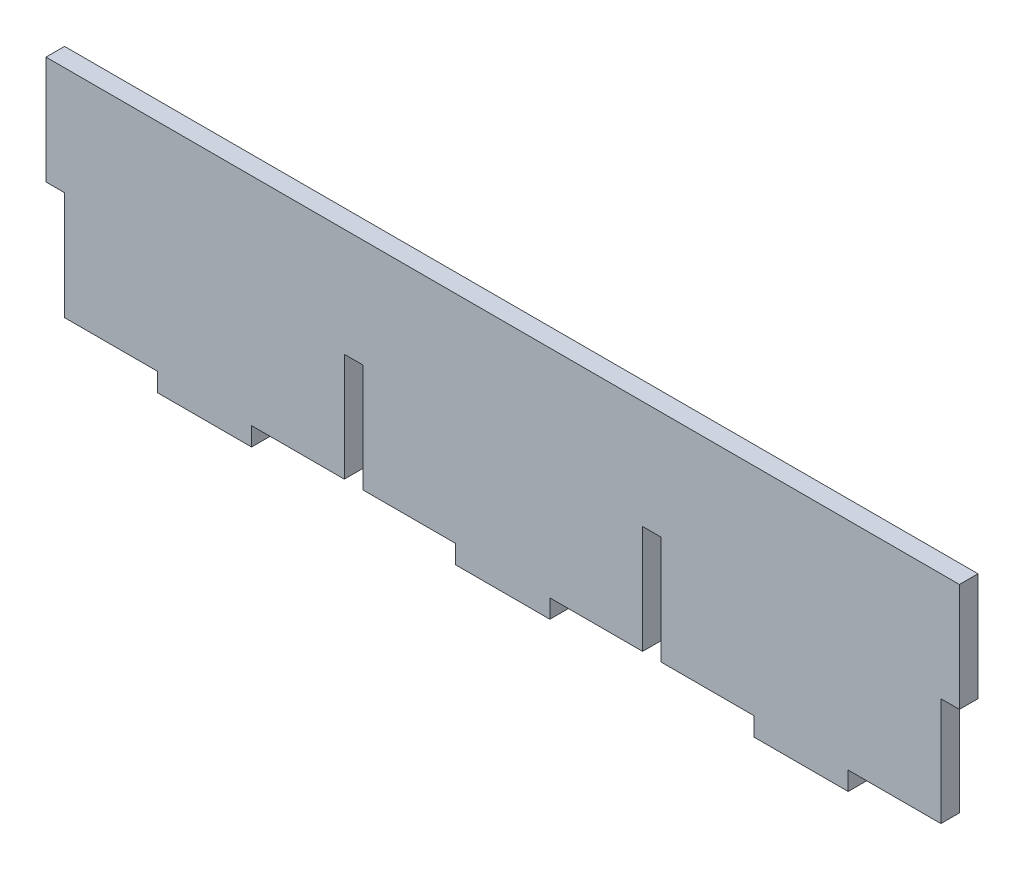
ISO-10303-21;
HEADER;
FILE_DESCRIPTION(('STEP AP214'),'2;1');
FILE_NAME('part.step','',(''),(''),'','','');
FILE_SCHEMA(('AUTOMOTIVE_DESIGN { 1 0 10303 214 1 1 1 1 }'));
ENDSEC;
DATA;
#1=APPLICATION_CONTEXT('core data for automotive mechanical design processes');
#2=APPLICATION_PROTOCOL_DEFINITION('international standard','automotive_design',2000,#1);
#3=PRODUCT_CONTEXT('',#1,'mechanical');
#4=PRODUCT('Part','Part','',(#3));
#5=PRODUCT_RELATED_PRODUCT_CATEGORY('part','',(#4));
#6=PRODUCT_DEFINITION_FORMATION('','',#4);
#7=PRODUCT_DEFINITION_CONTEXT('part definition',#1,'design');
#8=PRODUCT_DEFINITION('design','',#6,#7);
#9=PRODUCT_DEFINITION_SHAPE('','',#8);
#10=(LENGTH_UNIT() NAMED_UNIT(*) SI_UNIT(.MILLI.,.METRE.));
#11=(NAMED_UNIT(*) PLANE_ANGLE_UNIT() SI_UNIT($,.RADIAN.));
#12=(NAMED_UNIT(*) SI_UNIT($,.STERADIAN.) SOLID_ANGLE_UNIT());
#13=UNCERTAINTY_MEASURE_WITH_UNIT(LENGTH_MEASURE(1.E-05),#10,'distance_accuracy_value','');
#14=(GEOMETRIC_REPRESENTATION_CONTEXT(3) GLOBAL_UNCERTAINTY_ASSIGNED_CONTEXT((#13)) GLOBAL_UNIT_ASSIGNED_CONTEXT((#10,
#11,#12)) REPRESENTATION_CONTEXT('',''));
#15=CARTESIAN_POINT('',(0.,0.,0.));
#16=DIRECTION('',(0.,0.,1.));
#17=DIRECTION('',(1.,0.,0.));
#18=AXIS2_PLACEMENT_3D('',#15,#16,#17);
#19=CARTESIAN_POINT('',(55.875,0.,3.));
#20=DIRECTION('',(1.,0.,0.));
#21=DIRECTION('',(0.,0.,-1.));
#22=AXIS2_PLACEMENT_3D('',#19,#20,#21);
#23=PLANE('',#22);
#24=DIRECTION('',(0.,-1.,0.));
#25=VECTOR('',#24,1.);
#26=CARTESIAN_POINT('',(55.875,0.,0.));
#27=LINE('',#26,#25);
#28=CARTESIAN_POINT('',(55.875,-16.,0.));
#29=VERTEX_POINT('',#28);
#30=CARTESIAN_POINT('',(55.875,-19.,0.));
#31=VERTEX_POINT('',#30);
#32=EDGE_CURVE('E248',#29,#31,#27,.T.);
#33=ORIENTED_EDGE('',*,*,#32,.F.);
#34=DIRECTION('',(0.,0.,-1.));
#35=VECTOR('',#34,1.);
#36=CARTESIAN_POINT('',(55.875,-16.,3.));
#37=LINE('',#36,#35);
#38=CARTESIAN_POINT('',(55.875,-16.,3.));
#39=VERTEX_POINT('',#38);
#40=EDGE_CURVE('E11',#39,#29,#37,.T.);
#41=ORIENTED_EDGE('',*,*,#40,.F.);
#42=DIRECTION('',(0.,-1.,0.));
#43=VECTOR('',#42,1.);
#44=CARTESIAN_POINT('',(55.875,0.,3.));
#45=LINE('',#44,#43);
#46=CARTESIAN_POINT('',(55.875,-19.,3.));
#47=VERTEX_POINT('',#46);
#48=EDGE_CURVE('E396',#39,#47,#45,.T.);
#49=ORIENTED_EDGE('',*,*,#48,.T.);
#50=DIRECTION('',(0.,0.,-1.));
#51=VECTOR('',#50,1.);
#52=CARTESIAN_POINT('',(55.875,-19.,3.));
#53=LINE('',#52,#51);
#54=EDGE_CURVE('E145',#47,#31,#53,.T.);
#55=ORIENTED_EDGE('',*,*,#54,.T.);
#56=EDGE_LOOP('',(#33,#41,#49,#55));
#57=FACE_BOUND('',#56,.T.);
#58=ADVANCED_FACE('F34',(#57),#23,.T.);
#59=CARTESIAN_POINT('',(0.,-16.,3.));
#60=DIRECTION('',(0.,-1.,0.));
#61=DIRECTION('',(0.,0.,-1.));
#62=AXIS2_PLACEMENT_3D('',#59,#60,#61);
#63=PLANE('',#62);
#64=DIRECTION('',(-1.,0.,0.));
#65=VECTOR('',#64,1.);
#66=CARTESIAN_POINT('',(0.,-16.,0.));
#67=LINE('',#66,#65);
#68=CARTESIAN_POINT('',(70.875,-16.,0.));
#69=VERTEX_POINT('',#68);
#70=EDGE_CURVE('E251',#69,#29,#67,.T.);
#71=ORIENTED_EDGE('',*,*,#70,.F.);
#72=DIRECTION('',(0.,0.,-1.));
#73=VECTOR('',#72,1.);
#74=CARTESIAN_POINT('',(70.875,-16.,3.));
#75=LINE('',#74,#73);
#76=CARTESIAN_POINT('',(70.875,-16.,3.));
#77=VERTEX_POINT('',#76);
#78=EDGE_CURVE('E42',#77,#69,#75,.T.);
#79=ORIENTED_EDGE('',*,*,#78,.F.);
#80=DIRECTION('',(-1.,0.,0.));
#81=VECTOR('',#80,1.);
#82=CARTESIAN_POINT('',(0.,-16.,3.));
#83=LINE('',#82,#81);
#84=EDGE_CURVE('E392',#77,#39,#83,.T.);
#85=ORIENTED_EDGE('',*,*,#84,.T.);
#86=ORIENTED_EDGE('',*,*,#40,.T.);
#87=EDGE_LOOP('',(#71,#79,#85,#86));
#88=FACE_BOUND('',#87,.T.);
#89=ADVANCED_FACE('F381',(#88),#63,.T.);
#90=CARTESIAN_POINT('',(70.875,0.,3.));
#91=DIRECTION('',(1.,0.,0.));
#92=DIRECTION('',(0.,0.,-1.));
#93=AXIS2_PLACEMENT_3D('',#90,#91,#92);
#94=PLANE('',#93);
#95=DIRECTION('',(0.,-1.,0.));
#96=VECTOR('',#95,1.);
#97=CARTESIAN_POINT('',(70.875,0.,0.));
#98=LINE('',#97,#96);
#99=CARTESIAN_POINT('',(70.875,1.5,0.));
#100=VERTEX_POINT('',#99);
#101=EDGE_CURVE('E254',#100,#69,#98,.T.);
#102=ORIENTED_EDGE('',*,*,#101,.F.);
#103=DIRECTION('',(0.,0.,-1.));
#104=VECTOR('',#103,1.);
#105=CARTESIAN_POINT('',(70.875,1.5,3.));
#106=LINE('',#105,#104);
#107=CARTESIAN_POINT('',(70.875,1.5,3.));
#108=VERTEX_POINT('',#107);
#109=EDGE_CURVE('E370',#108,#100,#106,.T.);
#110=ORIENTED_EDGE('',*,*,#109,.F.);
#111=DIRECTION('',(0.,-1.,0.));
#112=VECTOR('',#111,1.);
#113=CARTESIAN_POINT('',(70.875,0.,3.));
#114=LINE('',#113,#112);
#115=EDGE_CURVE('E377',#108,#77,#114,.T.);
#116=ORIENTED_EDGE('',*,*,#115,.T.);
#117=ORIENTED_EDGE('',*,*,#78,.T.);
#118=EDGE_LOOP('',(#102,#110,#116,#117));
#119=FACE_BOUND('',#118,.T.);
#120=ADVANCED_FACE('F375',(#119),#94,.T.);
#121=CARTESIAN_POINT('',(0.,1.49999999999999,3.));
#122=DIRECTION('',(0.,-1.,0.));
#123=DIRECTION('',(1.,0.,0.));
#124=AXIS2_PLACEMENT_3D('',#121,#122,#123);
#125=PLANE('',#124);
#126=DIRECTION('',(-1.,0.,0.));
#127=VECTOR('',#126,1.);
#128=CARTESIAN_POINT('',(0.,1.49999999999999,0.));
#129=LINE('',#128,#127);
#130=CARTESIAN_POINT('',(73.875,1.5,0.));
#131=VERTEX_POINT('',#130);
#132=EDGE_CURVE('E257',#131,#100,#129,.T.);
#133=ORIENTED_EDGE('',*,*,#132,.F.);
#134=DIRECTION('',(0.,0.,-1.));
#135=VECTOR('',#134,1.);
#136=CARTESIAN_POINT('',(73.875,1.5,3.));
#137=LINE('',#136,#135);
#138=CARTESIAN_POINT('',(73.875,1.5,3.));
#139=VERTEX_POINT('',#138);
#140=EDGE_CURVE('E368',#139,#131,#137,.T.);
#141=ORIENTED_EDGE('',*,*,#140,.F.);
#142=DIRECTION('',(-1.,0.,0.));
#143=VECTOR('',#142,1.);
#144=CARTESIAN_POINT('',(0.,1.49999999999999,3.));
#145=LINE('',#144,#143);
#146=EDGE_CURVE('E391',#139,#108,#145,.T.);
#147=ORIENTED_EDGE('',*,*,#146,.T.);
#148=ORIENTED_EDGE('',*,*,#109,.T.);
#149=EDGE_LOOP('',(#133,#141,#147,#148));
#150=FACE_BOUND('',#149,.T.);
#151=ADVANCED_FACE('F387',(#150),#125,.T.);
#152=CARTESIAN_POINT('',(73.875,0.,3.));
#153=DIRECTION('',(-1.,0.,0.));
#154=DIRECTION('',(0.,0.,1.));
#155=AXIS2_PLACEMENT_3D('',#152,#153,#154);
#156=PLANE('',#155);
#157=DIRECTION('',(0.,1.,0.));
#158=VECTOR('',#157,1.);
#159=CARTESIAN_POINT('',(73.875,0.,0.));
#160=LINE('',#159,#158);
#161=CARTESIAN_POINT('',(73.875,19.,0.));
#162=VERTEX_POINT('',#161);
#163=EDGE_CURVE('E260',#131,#162,#160,.T.);
#164=ORIENTED_EDGE('',*,*,#163,.T.);
#165=DIRECTION('',(0.,0.,-1.));
#166=VECTOR('',#165,1.);
#167=CARTESIAN_POINT('',(73.875,19.,3.));
#168=LINE('',#167,#166);
#169=CARTESIAN_POINT('',(73.875,19.,3.));
#170=VERTEX_POINT('',#169);
#171=EDGE_CURVE('E366',#170,#162,#168,.T.);
#172=ORIENTED_EDGE('',*,*,#171,.F.);
#173=DIRECTION('',(0.,1.,0.));
#174=VECTOR('',#173,1.);
#175=CARTESIAN_POINT('',(73.875,0.,3.));
#176=LINE('',#175,#174);
#177=EDGE_CURVE('E394',#139,#170,#176,.T.);
#178=ORIENTED_EDGE('',*,*,#177,.F.);
#179=ORIENTED_EDGE('',*,*,#140,.T.);
#180=EDGE_LOOP('',(#164,#172,#178,#179));
#181=FACE_BOUND('',#180,.T.);
#182=ADVANCED_FACE('F529',(#181),#156,.F.);
#183=CARTESIAN_POINT('',(0.,19.,3.));
#184=DIRECTION('',(0.,1.,0.));
#185=DIRECTION('',(0.,0.,1.));
#186=AXIS2_PLACEMENT_3D('',#183,#184,#185);
#187=PLANE('',#186);
#188=DIRECTION('',(1.,0.,0.));
#189=VECTOR('',#188,1.);
#190=CARTESIAN_POINT('',(0.,19.,0.));
#191=LINE('',#190,#189);
#192=CARTESIAN_POINT('',(-73.875,19.,0.));
#193=VERTEX_POINT('',#192);
#194=EDGE_CURVE('E263',#193,#162,#191,.T.);
#195=ORIENTED_EDGE('',*,*,#194,.F.);
#196=DIRECTION('',(0.,0.,-1.));
#197=VECTOR('',#196,1.);
#198=CARTESIAN_POINT('',(-73.875,19.,3.));
#199=LINE('',#198,#197);
#200=CARTESIAN_POINT('',(-73.875,19.,3.));
#201=VERTEX_POINT('',#200);
#202=EDGE_CURVE('E364',#201,#193,#199,.T.);
#203=ORIENTED_EDGE('',*,*,#202,.F.);
#204=DIRECTION('',(1.,0.,0.));
#205=VECTOR('',#204,1.);
#206=CARTESIAN_POINT('',(0.,19.,3.));
#207=LINE('',#206,#205);
#208=EDGE_CURVE('E401',#201,#170,#207,.T.);
#209=ORIENTED_EDGE('',*,*,#208,.T.);
#210=ORIENTED_EDGE('',*,*,#171,.T.);
#211=EDGE_LOOP('',(#195,#203,#209,#210));
#212=FACE_BOUND('',#211,.T.);
#213=ADVANCED_FACE('F525',(#212),#187,.T.);
#214=CARTESIAN_POINT('',(-73.875,0.,3.));
#215=DIRECTION('',(-1.,0.,0.));
#216=DIRECTION('',(0.,0.,1.));
#217=AXIS2_PLACEMENT_3D('',#214,#215,#216);
#218=PLANE('',#217);
#219=DIRECTION('',(0.,1.,0.));
#220=VECTOR('',#219,1.);
#221=CARTESIAN_POINT('',(-73.875,0.,0.));
#222=LINE('',#221,#220);
#223=CARTESIAN_POINT('',(-73.875,1.5,0.));
#224=VERTEX_POINT('',#223);
#225=EDGE_CURVE('E266',#224,#193,#222,.T.);
#226=ORIENTED_EDGE('',*,*,#225,.F.);
#227=DIRECTION('',(0.,0.,-1.));
#228=VECTOR('',#227,1.);
#229=CARTESIAN_POINT('',(-73.875,1.5,3.));
#230=LINE('',#229,#228);
#231=CARTESIAN_POINT('',(-73.875,1.5,3.));
#232=VERTEX_POINT('',#231);
#233=EDGE_CURVE('E362',#232,#224,#230,.T.);
#234=ORIENTED_EDGE('',*,*,#233,.F.);
#235=DIRECTION('',(0.,1.,0.));
#236=VECTOR('',#235,1.);
#237=CARTESIAN_POINT('',(-73.875,0.,3.));
#238=LINE('',#237,#236);
#239=EDGE_CURVE('E404',#232,#201,#238,.T.);
#240=ORIENTED_EDGE('',*,*,#239,.T.);
#241=ORIENTED_EDGE('',*,*,#202,.T.);
#242=EDGE_LOOP('',(#226,#234,#240,#241));
#243=FACE_BOUND('',#242,.T.);
#244=ADVANCED_FACE('F522',(#243),#218,.T.);
#245=CARTESIAN_POINT('',(0.,1.5,3.));
#246=DIRECTION('',(0.,1.,0.));
#247=DIRECTION('',(0.,0.,1.));
#248=AXIS2_PLACEMENT_3D('',#245,#246,#247);
#249=PLANE('',#248);
#250=DIRECTION('',(1.,0.,0.));
#251=VECTOR('',#250,1.);
#252=CARTESIAN_POINT('',(0.,1.5,0.));
#253=LINE('',#252,#251);
#254=CARTESIAN_POINT('',(-70.875,1.5,0.));
#255=VERTEX_POINT('',#254);
#256=EDGE_CURVE('E269',#224,#255,#253,.T.);
#257=ORIENTED_EDGE('',*,*,#256,.T.);
#258=DIRECTION('',(0.,0.,-1.));
#259=VECTOR('',#258,1.);
#260=CARTESIAN_POINT('',(-70.875,1.5,3.));
#261=LINE('',#260,#259);
#262=CARTESIAN_POINT('',(-70.875,1.5,3.));
#263=VERTEX_POINT('',#262);
#264=EDGE_CURVE('E359',#263,#255,#261,.T.);
#265=ORIENTED_EDGE('',*,*,#264,.F.);
#266=DIRECTION('',(1.,0.,0.));
#267=VECTOR('',#266,1.);
#268=CARTESIAN_POINT('',(0.,1.5,3.));
#269=LINE('',#268,#267);
#270=EDGE_CURVE('E407',#232,#263,#269,.T.);
#271=ORIENTED_EDGE('',*,*,#270,.F.);
#272=ORIENTED_EDGE('',*,*,#233,.T.);
#273=EDGE_LOOP('',(#257,#265,#271,#272));
#274=FACE_BOUND('',#273,.T.);
#275=ADVANCED_FACE('F519',(#274),#249,.F.);
#276=CARTESIAN_POINT('',(-70.875,0.,3.));
#277=DIRECTION('',(1.,0.,0.));
#278=DIRECTION('',(0.,0.,-1.));
#279=AXIS2_PLACEMENT_3D('',#276,#277,#278);
#280=PLANE('',#279);
#281=DIRECTION('',(0.,-1.,0.));
#282=VECTOR('',#281,1.);
#283=CARTESIAN_POINT('',(-70.875,0.,0.));
#284=LINE('',#283,#282);
#285=CARTESIAN_POINT('',(-70.875,-16.,0.));
#286=VERTEX_POINT('',#285);
#287=EDGE_CURVE('E271',#255,#286,#284,.T.);
#288=ORIENTED_EDGE('',*,*,#287,.T.);
#289=DIRECTION('',(0.,0.,-1.));
#290=VECTOR('',#289,1.);
#291=CARTESIAN_POINT('',(-70.875,-16.,3.));
#292=LINE('',#291,#290);
#293=CARTESIAN_POINT('',(-70.875,-16.,3.));
#294=VERTEX_POINT('',#293);
#295=EDGE_CURVE('E357',#294,#286,#292,.T.);
#296=ORIENTED_EDGE('',*,*,#295,.F.);
#297=DIRECTION('',(0.,-1.,0.));
#298=VECTOR('',#297,1.);
#299=CARTESIAN_POINT('',(-70.875,0.,3.));
#300=LINE('',#299,#298);
#301=EDGE_CURVE('E409',#263,#294,#300,.T.);
#302=ORIENTED_EDGE('',*,*,#301,.F.);
#303=ORIENTED_EDGE('',*,*,#264,.T.);
#304=EDGE_LOOP('',(#288,#296,#302,#303));
#305=FACE_BOUND('',#304,.T.);
#306=ADVANCED_FACE('F514',(#305),#280,.F.);
#307=CARTESIAN_POINT('',(0.,-16.,3.));
#308=DIRECTION('',(0.,-1.,0.));
#309=DIRECTION('',(0.,0.,-1.));
#310=AXIS2_PLACEMENT_3D('',#307,#308,#309);
#311=PLANE('',#310);
#312=DIRECTION('',(-1.,0.,0.));
#313=VECTOR('',#312,1.);
#314=CARTESIAN_POINT('',(0.,-16.,0.));
#315=LINE('',#314,#313);
#316=CARTESIAN_POINT('',(-55.875,-16.,0.));
#317=VERTEX_POINT('',#316);
#318=EDGE_CURVE('E274',#317,#286,#315,.T.);
#319=ORIENTED_EDGE('',*,*,#318,.F.);
#320=DIRECTION('',(0.,0.,-1.));
#321=VECTOR('',#320,1.);
#322=CARTESIAN_POINT('',(-55.875,-16.,3.));
#323=LINE('',#322,#321);
#324=CARTESIAN_POINT('',(-55.875,-16.,3.));
#325=VERTEX_POINT('',#324);
#326=EDGE_CURVE('E355',#325,#317,#323,.T.);
#327=ORIENTED_EDGE('',*,*,#326,.F.);
#328=DIRECTION('',(-1.,0.,0.));
#329=VECTOR('',#328,1.);
#330=CARTESIAN_POINT('',(0.,-16.,3.));
#331=LINE('',#330,#329);
#332=EDGE_CURVE('E411',#325,#294,#331,.T.);
#333=ORIENTED_EDGE('',*,*,#332,.T.);
#334=ORIENTED_EDGE('',*,*,#295,.T.);
#335=EDGE_LOOP('',(#319,#327,#333,#334));
#336=FACE_BOUND('',#335,.T.);
#337=ADVANCED_FACE('F508',(#336),#311,.T.);
#338=CARTESIAN_POINT('',(-55.875,0.,3.));
#339=DIRECTION('',(-1.,0.,0.));
#340=DIRECTION('',(0.,0.,1.));
#341=AXIS2_PLACEMENT_3D('',#338,#339,#340);
#342=PLANE('',#341);
#343=DIRECTION('',(0.,1.,0.));
#344=VECTOR('',#343,1.);
#345=CARTESIAN_POINT('',(-55.875,0.,0.));
#346=LINE('',#345,#344);
#347=CARTESIAN_POINT('',(-55.875,-19.,0.));
#348=VERTEX_POINT('',#347);
#349=EDGE_CURVE('E277',#348,#317,#346,.T.);
#350=ORIENTED_EDGE('',*,*,#349,.F.);
#351=DIRECTION('',(0.,0.,-1.));
#352=VECTOR('',#351,1.);
#353=CARTESIAN_POINT('',(-55.875,-19.,3.));
#354=LINE('',#353,#352);
#355=CARTESIAN_POINT('',(-55.875,-19.,3.));
#356=VERTEX_POINT('',#355);
#357=EDGE_CURVE('E353',#356,#348,#354,.T.);
#358=ORIENTED_EDGE('',*,*,#357,.F.);
#359=DIRECTION('',(0.,1.,0.));
#360=VECTOR('',#359,1.);
#361=CARTESIAN_POINT('',(-55.875,0.,3.));
#362=LINE('',#361,#360);
#363=EDGE_CURVE('E414',#356,#325,#362,.T.);
#364=ORIENTED_EDGE('',*,*,#363,.T.);
#365=ORIENTED_EDGE('',*,*,#326,.T.);
#366=EDGE_LOOP('',(#350,#358,#364,#365));
#367=FACE_BOUND('',#366,.T.);
#368=ADVANCED_FACE('F502',(#367),#342,.T.);
#369=CARTESIAN_POINT('',(0.,-19.,3.));
#370=DIRECTION('',(0.,1.,0.));
#371=DIRECTION('',(0.,0.,1.));
#372=AXIS2_PLACEMENT_3D('',#369,#370,#371);
#373=PLANE('',#372);
#374=DIRECTION('',(1.,0.,0.));
#375=VECTOR('',#374,1.);
#376=CARTESIAN_POINT('',(0.,-19.,0.));
#377=LINE('',#376,#375);
#378=CARTESIAN_POINT('',(-40.625,-19.,0.));
#379=VERTEX_POINT('',#378);
#380=EDGE_CURVE('E280',#348,#379,#377,.T.);
#381=ORIENTED_EDGE('',*,*,#380,.T.);
#382=DIRECTION('',(0.,0.,-1.));
#383=VECTOR('',#382,1.);
#384=CARTESIAN_POINT('',(-40.625,-19.,3.));
#385=LINE('',#384,#383);
#386=CARTESIAN_POINT('',(-40.625,-19.,3.));
#387=VERTEX_POINT('',#386);
#388=EDGE_CURVE('E351',#387,#379,#385,.T.);
#389=ORIENTED_EDGE('',*,*,#388,.F.);
#390=DIRECTION('',(1.,0.,0.));
#391=VECTOR('',#390,1.);
#392=CARTESIAN_POINT('',(0.,-19.,3.));
#393=LINE('',#392,#391);
#394=EDGE_CURVE('E245',#356,#387,#393,.T.);
#395=ORIENTED_EDGE('',*,*,#394,.F.);
#396=ORIENTED_EDGE('',*,*,#357,.T.);
#397=EDGE_LOOP('',(#381,#389,#395,#396));
#398=FACE_BOUND('',#397,.T.);
#399=ADVANCED_FACE('F530',(#398),#373,.F.);
#400=CARTESIAN_POINT('',(-40.625,0.,3.));
#401=DIRECTION('',(1.,0.,0.));
#402=DIRECTION('',(0.,0.,-1.));
#403=AXIS2_PLACEMENT_3D('',#400,#401,#402);
#404=PLANE('',#403);
#405=DIRECTION('',(0.,-1.,0.));
#406=VECTOR('',#405,1.);
#407=CARTESIAN_POINT('',(-40.625,0.,0.));
#408=LINE('',#407,#406);
#409=CARTESIAN_POINT('',(-40.625,-16.,0.));
#410=VERTEX_POINT('',#409);
#411=EDGE_CURVE('E283',#410,#379,#408,.T.);
#412=ORIENTED_EDGE('',*,*,#411,.F.);
#413=DIRECTION('',(0.,0.,-1.));
#414=VECTOR('',#413,1.);
#415=CARTESIAN_POINT('',(-40.625,-16.,3.));
#416=LINE('',#415,#414);
#417=CARTESIAN_POINT('',(-40.625,-16.,3.));
#418=VERTEX_POINT('',#417);
#419=EDGE_CURVE('E349',#418,#410,#416,.T.);
#420=ORIENTED_EDGE('',*,*,#419,.F.);
#421=DIRECTION('',(0.,-1.,0.));
#422=VECTOR('',#421,1.);
#423=CARTESIAN_POINT('',(-40.625,0.,3.));
#424=LINE('',#423,#422);
#425=EDGE_CURVE('E417',#418,#387,#424,.T.);
#426=ORIENTED_EDGE('',*,*,#425,.T.);
#427=ORIENTED_EDGE('',*,*,#388,.T.);
#428=EDGE_LOOP('',(#412,#420,#426,#427));
#429=FACE_BOUND('',#428,.T.);
#430=ADVANCED_FACE('F496',(#429),#404,.T.);
#431=CARTESIAN_POINT('',(0.,-16.,3.));
#432=DIRECTION('',(0.,-1.,0.));
#433=DIRECTION('',(1.,0.,0.));
#434=AXIS2_PLACEMENT_3D('',#431,#432,#433);
#435=PLANE('',#434);
#436=DIRECTION('',(-1.,0.,0.));
#437=VECTOR('',#436,1.);
#438=CARTESIAN_POINT('',(0.,-16.,0.));
#439=LINE('',#438,#437);
#440=CARTESIAN_POINT('',(-25.625,-16.,0.));
#441=VERTEX_POINT('',#440);
#442=EDGE_CURVE('E288',#441,#410,#439,.T.);
#443=ORIENTED_EDGE('',*,*,#442,.F.);
#444=DIRECTION('',(0.,0.,-1.));
#445=VECTOR('',#444,1.);
#446=CARTESIAN_POINT('',(-25.625,-16.,3.));
#447=LINE('',#446,#445);
#448=CARTESIAN_POINT('',(-25.625,-16.,3.));
#449=VERTEX_POINT('',#448);
#450=EDGE_CURVE('E347',#449,#441,#447,.T.);
#451=ORIENTED_EDGE('',*,*,#450,.F.);
#452=DIRECTION('',(-1.,0.,0.));
#453=VECTOR('',#452,1.);
#454=CARTESIAN_POINT('',(0.,-16.,3.));
#455=LINE('',#454,#453);
#456=EDGE_CURVE('E420',#449,#418,#455,.T.);
#457=ORIENTED_EDGE('',*,*,#456,.T.);
#458=ORIENTED_EDGE('',*,*,#419,.T.);
#459=EDGE_LOOP('',(#443,#451,#457,#458));
#460=FACE_BOUND('',#459,.T.);
#461=ADVANCED_FACE('F492',(#460),#435,.T.);
#462=CARTESIAN_POINT('',(-25.625,0.,3.));
#463=DIRECTION('',(1.,0.,0.));
#464=DIRECTION('',(0.,1.,0.));
#465=AXIS2_PLACEMENT_3D('',#462,#463,#464);
#466=PLANE('',#465);
#467=DIRECTION('',(0.,-1.,0.));
#468=VECTOR('',#467,1.);
#469=CARTESIAN_POINT('',(-25.625,0.,0.));
#470=LINE('',#469,#468);
#471=CARTESIAN_POINT('',(-25.625,1.5,0.));
#472=VERTEX_POINT('',#471);
#473=EDGE_CURVE('E291',#472,#441,#470,.T.);
#474=ORIENTED_EDGE('',*,*,#473,.F.);
#475=DIRECTION('',(0.,0.,-1.));
#476=VECTOR('',#475,1.);
#477=CARTESIAN_POINT('',(-25.625,1.5,3.));
#478=LINE('',#477,#476);
#479=CARTESIAN_POINT('',(-25.625,1.5,3.));
#480=VERTEX_POINT('',#479);
#481=EDGE_CURVE('E345',#480,#472,#478,.T.);
#482=ORIENTED_EDGE('',*,*,#481,.F.);
#483=DIRECTION('',(0.,-1.,0.));
#484=VECTOR('',#483,1.);
#485=CARTESIAN_POINT('',(-25.625,0.,3.));
#486=LINE('',#485,#484);
#487=EDGE_CURVE('E423',#480,#449,#486,.T.);
#488=ORIENTED_EDGE('',*,*,#487,.T.);
#489=ORIENTED_EDGE('',*,*,#450,.T.);
#490=EDGE_LOOP('',(#474,#482,#488,#489));
#491=FACE_BOUND('',#490,.T.);
#492=ADVANCED_FACE('F488',(#491),#466,.T.);
#493=CARTESIAN_POINT('',(0.,1.5,3.));
#494=DIRECTION('',(0.,-1.,0.));
#495=DIRECTION('',(1.,0.,0.));
#496=AXIS2_PLACEMENT_3D('',#493,#494,#495);
#497=PLANE('',#496);
#498=DIRECTION('',(-1.,0.,0.));
#499=VECTOR('',#498,1.);
#500=CARTESIAN_POINT('',(0.,1.5,0.));
#501=LINE('',#500,#499);
#502=CARTESIAN_POINT('',(-22.625,1.5,0.));
#503=VERTEX_POINT('',#502);
#504=EDGE_CURVE('E294',#503,#472,#501,.T.);
#505=ORIENTED_EDGE('',*,*,#504,.F.);
#506=DIRECTION('',(0.,0.,-1.));
#507=VECTOR('',#506,1.);
#508=CARTESIAN_POINT('',(-22.625,1.5,3.));
#509=LINE('',#508,#507);
#510=CARTESIAN_POINT('',(-22.625,1.5,3.));
#511=VERTEX_POINT('',#510);
#512=EDGE_CURVE('E343',#511,#503,#509,.T.);
#513=ORIENTED_EDGE('',*,*,#512,.F.);
#514=DIRECTION('',(-1.,0.,0.));
#515=VECTOR('',#514,1.);
#516=CARTESIAN_POINT('',(0.,1.5,3.));
#517=LINE('',#516,#515);
#518=EDGE_CURVE('E426',#511,#480,#517,.T.);
#519=ORIENTED_EDGE('',*,*,#518,.T.);
#520=ORIENTED_EDGE('',*,*,#481,.T.);
#521=EDGE_LOOP('',(#505,#513,#519,#520));
#522=FACE_BOUND('',#521,.T.);
#523=ADVANCED_FACE('F484',(#522),#497,.T.);
#524=CARTESIAN_POINT('',(-22.625,0.,3.));
#525=DIRECTION('',(-1.,0.,0.));
#526=DIRECTION('',(0.,0.,1.));
#527=AXIS2_PLACEMENT_3D('',#524,#525,#526);
#528=PLANE('',#527);
#529=DIRECTION('',(0.,1.,0.));
#530=VECTOR('',#529,1.);
#531=CARTESIAN_POINT('',(-22.625,0.,0.));
#532=LINE('',#531,#530);
#533=CARTESIAN_POINT('',(-22.625,-16.,0.));
#534=VERTEX_POINT('',#533);
#535=EDGE_CURVE('E297',#534,#503,#532,.T.);
#536=ORIENTED_EDGE('',*,*,#535,.F.);
#537=DIRECTION('',(0.,0.,-1.));
#538=VECTOR('',#537,1.);
#539=CARTESIAN_POINT('',(-22.625,-16.,3.));
#540=LINE('',#539,#538);
#541=CARTESIAN_POINT('',(-22.625,-16.,3.));
#542=VERTEX_POINT('',#541);
#543=EDGE_CURVE('E341',#542,#534,#540,.T.);
#544=ORIENTED_EDGE('',*,*,#543,.F.);
#545=DIRECTION('',(0.,1.,0.));
#546=VECTOR('',#545,1.);
#547=CARTESIAN_POINT('',(-22.625,0.,3.));
#548=LINE('',#547,#546);
#549=EDGE_CURVE('E429',#542,#511,#548,.T.);
#550=ORIENTED_EDGE('',*,*,#549,.T.);
#551=ORIENTED_EDGE('',*,*,#512,.T.);
#552=EDGE_LOOP('',(#536,#544,#550,#551));
#553=FACE_BOUND('',#552,.T.);
#554=ADVANCED_FACE('F480',(#553),#528,.T.);
#555=CARTESIAN_POINT('',(0.,-16.,3.));
#556=DIRECTION('',(0.,1.,0.));
#557=DIRECTION('',(-1.,0.,0.));
#558=AXIS2_PLACEMENT_3D('',#555,#556,#557);
#559=PLANE('',#558);
#560=DIRECTION('',(1.,0.,0.));
#561=VECTOR('',#560,1.);
#562=CARTESIAN_POINT('',(0.,-16.,0.));
#563=LINE('',#562,#561);
#564=CARTESIAN_POINT('',(-7.625,-16.,0.));
#565=VERTEX_POINT('',#564);
#566=EDGE_CURVE('E300',#534,#565,#563,.T.);
#567=ORIENTED_EDGE('',*,*,#566,.T.);
#568=DIRECTION('',(0.,0.,-1.));
#569=VECTOR('',#568,1.);
#570=CARTESIAN_POINT('',(-7.625,-16.,3.));
#571=LINE('',#570,#569);
#572=CARTESIAN_POINT('',(-7.625,-16.,3.));
#573=VERTEX_POINT('',#572);
#574=EDGE_CURVE('E338',#573,#565,#571,.T.);
#575=ORIENTED_EDGE('',*,*,#574,.F.);
#576=DIRECTION('',(1.,0.,0.));
#577=VECTOR('',#576,1.);
#578=CARTESIAN_POINT('',(0.,-16.,3.));
#579=LINE('',#578,#577);
#580=EDGE_CURVE('E432',#542,#573,#579,.T.);
#581=ORIENTED_EDGE('',*,*,#580,.F.);
#582=ORIENTED_EDGE('',*,*,#543,.T.);
#583=EDGE_LOOP('',(#567,#575,#581,#582));
#584=FACE_BOUND('',#583,.T.);
#585=ADVANCED_FACE('F575',(#584),#559,.F.);
#586=CARTESIAN_POINT('',(-7.625,0.,3.));
#587=DIRECTION('',(1.,0.,0.));
#588=DIRECTION('',(0.,0.,-1.));
#589=AXIS2_PLACEMENT_3D('',#586,#587,#588);
#590=PLANE('',#589);
#591=DIRECTION('',(0.,-1.,0.));
#592=VECTOR('',#591,1.);
#593=CARTESIAN_POINT('',(-7.625,0.,0.));
#594=LINE('',#593,#592);
#595=CARTESIAN_POINT('',(-7.625,-19.,0.));
#596=VERTEX_POINT('',#595);
#597=EDGE_CURVE('E302',#565,#596,#594,.T.);
#598=ORIENTED_EDGE('',*,*,#597,.T.);
#599=DIRECTION('',(0.,0.,-1.));
#600=VECTOR('',#599,1.);
#601=CARTESIAN_POINT('',(-7.625,-19.,3.));
#602=LINE('',#601,#600);
#603=CARTESIAN_POINT('',(-7.625,-19.,3.));
#604=VERTEX_POINT('',#603);
#605=EDGE_CURVE('E335',#604,#596,#602,.T.);
#606=ORIENTED_EDGE('',*,*,#605,.F.);
#607=DIRECTION('',(0.,-1.,0.));
#608=VECTOR('',#607,1.);
#609=CARTESIAN_POINT('',(-7.625,0.,3.));
#610=LINE('',#609,#608);
#611=EDGE_CURVE('E434',#573,#604,#610,.T.);
#612=ORIENTED_EDGE('',*,*,#611,.F.);
#613=ORIENTED_EDGE('',*,*,#574,.T.);
#614=EDGE_LOOP('',(#598,#606,#612,#613));
#615=FACE_BOUND('',#614,.T.);
#616=ADVANCED_FACE('F475',(#615),#590,.F.);
#617=CARTESIAN_POINT('',(7.625,-19.,0.));
#618=VERTEX_POINT('',#617);
#619=EDGE_CURVE('E285',#596,#618,#377,.T.);
#620=ORIENTED_EDGE('',*,*,#619,.T.);
#621=DIRECTION('',(0.,0.,-1.));
#622=VECTOR('',#621,1.);
#623=CARTESIAN_POINT('',(7.625,-19.,3.));
#624=LINE('',#623,#622);
#625=CARTESIAN_POINT('',(7.625,-19.,3.));
#626=VERTEX_POINT('',#625);
#627=EDGE_CURVE('E332',#626,#618,#624,.T.);
#628=ORIENTED_EDGE('',*,*,#627,.F.);
#629=EDGE_CURVE('E244',#604,#626,#393,.T.);
#630=ORIENTED_EDGE('',*,*,#629,.F.);
#631=ORIENTED_EDGE('',*,*,#605,.T.);
#632=EDGE_LOOP('',(#620,#628,#630,#631));
#633=FACE_BOUND('',#632,.T.);
#634=ADVANCED_FACE('F454',(#633),#373,.F.);
#635=CARTESIAN_POINT('',(7.62500000000001,0.,3.));
#636=DIRECTION('',(-1.,0.,0.));
#637=DIRECTION('',(0.,-1.,0.));
#638=AXIS2_PLACEMENT_3D('',#635,#636,#637);
#639=PLANE('',#638);
#640=DIRECTION('',(0.,1.,0.));
#641=VECTOR('',#640,1.);
#642=CARTESIAN_POINT('',(7.62500000000001,0.,0.));
#643=LINE('',#642,#641);
#644=CARTESIAN_POINT('',(7.625,-16.,0.));
#645=VERTEX_POINT('',#644);
#646=EDGE_CURVE('E304',#618,#645,#643,.T.);
#647=ORIENTED_EDGE('',*,*,#646,.T.);
#648=DIRECTION('',(0.,0.,-1.));
#649=VECTOR('',#648,1.);
#650=CARTESIAN_POINT('',(7.625,-16.,3.));
#651=LINE('',#650,#649);
#652=CARTESIAN_POINT('',(7.625,-16.,3.));
#653=VERTEX_POINT('',#652);
#654=EDGE_CURVE('E329',#653,#645,#651,.T.);
#655=ORIENTED_EDGE('',*,*,#654,.F.);
#656=DIRECTION('',(0.,1.,0.));
#657=VECTOR('',#656,1.);
#658=CARTESIAN_POINT('',(7.62500000000001,0.,3.));
#659=LINE('',#658,#657);
#660=EDGE_CURVE('E436',#626,#653,#659,.T.);
#661=ORIENTED_EDGE('',*,*,#660,.F.);
#662=ORIENTED_EDGE('',*,*,#627,.T.);
#663=EDGE_LOOP('',(#647,#655,#661,#662));
#664=FACE_BOUND('',#663,.T.);
#665=ADVANCED_FACE('F461',(#664),#639,.F.);
#666=CARTESIAN_POINT('',(0.,-16.,3.));
#667=DIRECTION('',(0.,1.,0.));
#668=DIRECTION('',(0.,0.,1.));
#669=AXIS2_PLACEMENT_3D('',#666,#667,#668);
#670=PLANE('',#669);
#671=DIRECTION('',(1.,0.,0.));
#672=VECTOR('',#671,1.);
#673=CARTESIAN_POINT('',(0.,-16.,0.));
#674=LINE('',#673,#672);
#675=CARTESIAN_POINT('',(22.625,-16.,0.));
#676=VERTEX_POINT('',#675);
#677=EDGE_CURVE('E306',#645,#676,#674,.T.);
#678=ORIENTED_EDGE('',*,*,#677,.T.);
#679=DIRECTION('',(0.,0.,-1.));
#680=VECTOR('',#679,1.);
#681=CARTESIAN_POINT('',(22.625,-16.,3.));
#682=LINE('',#681,#680);
#683=CARTESIAN_POINT('',(22.625,-16.,3.));
#684=VERTEX_POINT('',#683);
#685=EDGE_CURVE('E327',#684,#676,#682,.T.);
#686=ORIENTED_EDGE('',*,*,#685,.F.);
#687=DIRECTION('',(1.,0.,0.));
#688=VECTOR('',#687,1.);
#689=CARTESIAN_POINT('',(0.,-16.,3.));
#690=LINE('',#689,#688);
#691=EDGE_CURVE('E438',#653,#684,#690,.T.);
#692=ORIENTED_EDGE('',*,*,#691,.F.);
#693=ORIENTED_EDGE('',*,*,#654,.T.);
#694=EDGE_LOOP('',(#678,#686,#692,#693));
#695=FACE_BOUND('',#694,.T.);
#696=ADVANCED_FACE('F467',(#695),#670,.F.);
#697=CARTESIAN_POINT('',(22.625,0.,3.));
#698=DIRECTION('',(1.,0.,0.));
#699=DIRECTION('',(0.,1.,0.));
#700=AXIS2_PLACEMENT_3D('',#697,#698,#699);
#701=PLANE('',#700);
#702=DIRECTION('',(0.,-1.,0.));
#703=VECTOR('',#702,1.);
#704=CARTESIAN_POINT('',(22.625,0.,0.));
#705=LINE('',#704,#703);
#706=CARTESIAN_POINT('',(22.625,1.5,0.));
#707=VERTEX_POINT('',#706);
#708=EDGE_CURVE('E309',#707,#676,#705,.T.);
#709=ORIENTED_EDGE('',*,*,#708,.F.);
#710=DIRECTION('',(0.,0.,-1.));
#711=VECTOR('',#710,1.);
#712=CARTESIAN_POINT('',(22.625,1.5,3.));
#713=LINE('',#712,#711);
#714=CARTESIAN_POINT('',(22.625,1.5,3.));
#715=VERTEX_POINT('',#714);
#716=EDGE_CURVE('E325',#715,#707,#713,.T.);
#717=ORIENTED_EDGE('',*,*,#716,.F.);
#718=DIRECTION('',(0.,-1.,0.));
#719=VECTOR('',#718,1.);
#720=CARTESIAN_POINT('',(22.625,0.,3.));
#721=LINE('',#720,#719);
#722=EDGE_CURVE('E440',#715,#684,#721,.T.);
#723=ORIENTED_EDGE('',*,*,#722,.T.);
#724=ORIENTED_EDGE('',*,*,#685,.T.);
#725=EDGE_LOOP('',(#709,#717,#723,#724));
#726=FACE_BOUND('',#725,.T.);
#727=ADVANCED_FACE('F584',(#726),#701,.T.);
#728=CARTESIAN_POINT('',(0.,1.5,3.));
#729=DIRECTION('',(0.,-1.,0.));
#730=DIRECTION('',(1.,0.,0.));
#731=AXIS2_PLACEMENT_3D('',#728,#729,#730);
#732=PLANE('',#731);
#733=DIRECTION('',(-1.,0.,0.));
#734=VECTOR('',#733,1.);
#735=CARTESIAN_POINT('',(0.,1.5,0.));
#736=LINE('',#735,#734);
#737=CARTESIAN_POINT('',(25.625,1.5,0.));
#738=VERTEX_POINT('',#737);
#739=EDGE_CURVE('E312',#738,#707,#736,.T.);
#740=ORIENTED_EDGE('',*,*,#739,.F.);
#741=DIRECTION('',(0.,0.,-1.));
#742=VECTOR('',#741,1.);
#743=CARTESIAN_POINT('',(25.625,1.5,3.));
#744=LINE('',#743,#742);
#745=CARTESIAN_POINT('',(25.625,1.5,3.));
#746=VERTEX_POINT('',#745);
#747=EDGE_CURVE('E323',#746,#738,#744,.T.);
#748=ORIENTED_EDGE('',*,*,#747,.F.);
#749=DIRECTION('',(-1.,0.,0.));
#750=VECTOR('',#749,1.);
#751=CARTESIAN_POINT('',(0.,1.5,3.));
#752=LINE('',#751,#750);
#753=EDGE_CURVE('E443',#746,#715,#752,.T.);
#754=ORIENTED_EDGE('',*,*,#753,.T.);
#755=ORIENTED_EDGE('',*,*,#716,.T.);
#756=EDGE_LOOP('',(#740,#748,#754,#755));
#757=FACE_BOUND('',#756,.T.);
#758=ADVANCED_FACE('F587',(#757),#732,.T.);
#759=CARTESIAN_POINT('',(25.625,0.,3.));
#760=DIRECTION('',(-1.,0.,0.));
#761=DIRECTION('',(0.,-1.,0.));
#762=AXIS2_PLACEMENT_3D('',#759,#760,#761);
#763=PLANE('',#762);
#764=DIRECTION('',(0.,1.,0.));
#765=VECTOR('',#764,1.);
#766=CARTESIAN_POINT('',(25.625,0.,0.));
#767=LINE('',#766,#765);
#768=CARTESIAN_POINT('',(25.625,-16.,0.));
#769=VERTEX_POINT('',#768);
#770=EDGE_CURVE('E315',#769,#738,#767,.T.);
#771=ORIENTED_EDGE('',*,*,#770,.F.);
#772=DIRECTION('',(0.,0.,-1.));
#773=VECTOR('',#772,1.);
#774=CARTESIAN_POINT('',(25.625,-16.,3.));
#775=LINE('',#774,#773);
#776=CARTESIAN_POINT('',(25.625,-16.,3.));
#777=VERTEX_POINT('',#776);
#778=EDGE_CURVE('E238',#777,#769,#775,.T.);
#779=ORIENTED_EDGE('',*,*,#778,.F.);
#780=DIRECTION('',(0.,1.,0.));
#781=VECTOR('',#780,1.);
#782=CARTESIAN_POINT('',(25.625,0.,3.));
#783=LINE('',#782,#781);
#784=EDGE_CURVE('E231',#777,#746,#783,.T.);
#785=ORIENTED_EDGE('',*,*,#784,.T.);
#786=ORIENTED_EDGE('',*,*,#747,.T.);
#787=EDGE_LOOP('',(#771,#779,#785,#786));
#788=FACE_BOUND('',#787,.T.);
#789=ADVANCED_FACE('F447',(#788),#763,.T.);
#790=CARTESIAN_POINT('',(0.,-16.,3.));
#791=DIRECTION('',(0.,1.,0.));
#792=DIRECTION('',(-1.,0.,0.));
#793=AXIS2_PLACEMENT_3D('',#790,#791,#792);
#794=PLANE('',#793);
#795=DIRECTION('',(1.,0.,0.));
#796=VECTOR('',#795,1.);
#797=CARTESIAN_POINT('',(0.,-16.,0.));
#798=LINE('',#797,#796);
#799=CARTESIAN_POINT('',(40.625,-16.,0.));
#800=VERTEX_POINT('',#799);
#801=EDGE_CURVE('E237',#769,#800,#798,.T.);
#802=ORIENTED_EDGE('',*,*,#801,.T.);
#803=DIRECTION('',(0.,0.,-1.));
#804=VECTOR('',#803,1.);
#805=CARTESIAN_POINT('',(40.625,-16.,3.));
#806=LINE('',#805,#804);
#807=CARTESIAN_POINT('',(40.625,-16.,3.));
#808=VERTEX_POINT('',#807);
#809=EDGE_CURVE('E234',#808,#800,#806,.T.);
#810=ORIENTED_EDGE('',*,*,#809,.F.);
#811=DIRECTION('',(1.,0.,0.));
#812=VECTOR('',#811,1.);
#813=CARTESIAN_POINT('',(0.,-16.,3.));
#814=LINE('',#813,#812);
#815=EDGE_CURVE('E224',#777,#808,#814,.T.);
#816=ORIENTED_EDGE('',*,*,#815,.F.);
#817=ORIENTED_EDGE('',*,*,#778,.T.);
#818=EDGE_LOOP('',(#802,#810,#816,#817));
#819=FACE_BOUND('',#818,.T.);
#820=ADVANCED_FACE('F235',(#819),#794,.F.);
#821=CARTESIAN_POINT('',(40.625,0.,3.));
#822=DIRECTION('',(1.,0.,0.));
#823=DIRECTION('',(0.,0.,-1.));
#824=AXIS2_PLACEMENT_3D('',#821,#822,#823);
#825=PLANE('',#824);
#826=DIRECTION('',(0.,-1.,0.));
#827=VECTOR('',#826,1.);
#828=CARTESIAN_POINT('',(40.625,0.,0.));
#829=LINE('',#828,#827);
#830=CARTESIAN_POINT('',(40.625,-19.,0.));
#831=VERTEX_POINT('',#830);
#832=EDGE_CURVE('E138',#800,#831,#829,.T.);
#833=ORIENTED_EDGE('',*,*,#832,.T.);
#834=DIRECTION('',(0.,0.,-1.));
#835=VECTOR('',#834,1.);
#836=CARTESIAN_POINT('',(40.625,-19.,3.));
#837=LINE('',#836,#835);
#838=CARTESIAN_POINT('',(40.625,-19.,3.));
#839=VERTEX_POINT('',#838);
#840=EDGE_CURVE('E239',#839,#831,#837,.T.);
#841=ORIENTED_EDGE('',*,*,#840,.F.);
#842=DIRECTION('',(0.,-1.,0.));
#843=VECTOR('',#842,1.);
#844=CARTESIAN_POINT('',(40.625,0.,3.));
#845=LINE('',#844,#843);
#846=EDGE_CURVE('E228',#808,#839,#845,.T.);
#847=ORIENTED_EDGE('',*,*,#846,.F.);
#848=ORIENTED_EDGE('',*,*,#809,.T.);
#849=EDGE_LOOP('',(#833,#841,#847,#848));
#850=FACE_BOUND('',#849,.T.);
#851=ADVANCED_FACE('F241',(#850),#825,.F.);
#852=EDGE_CURVE('E284',#831,#31,#377,.T.);
#853=ORIENTED_EDGE('',*,*,#852,.T.);
#854=ORIENTED_EDGE('',*,*,#54,.F.);
#855=EDGE_CURVE('E50',#839,#47,#393,.T.);
#856=ORIENTED_EDGE('',*,*,#855,.F.);
#857=ORIENTED_EDGE('',*,*,#840,.T.);
#858=EDGE_LOOP('',(#853,#854,#856,#857));
#859=FACE_BOUND('',#858,.T.);
#860=ADVANCED_FACE('F533',(#859),#373,.F.);
#861=CARTESIAN_POINT('',(0.,0.,3.));
#862=DIRECTION('',(0.,0.,1.));
#863=DIRECTION('',(1.,0.,0.));
#864=AXIS2_PLACEMENT_3D('',#861,#862,#863);
#865=PLANE('',#864);
#866=ORIENTED_EDGE('',*,*,#48,.F.);
#867=ORIENTED_EDGE('',*,*,#84,.F.);
#868=ORIENTED_EDGE('',*,*,#115,.F.);
#869=ORIENTED_EDGE('',*,*,#146,.F.);
#870=ORIENTED_EDGE('',*,*,#177,.T.);
#871=ORIENTED_EDGE('',*,*,#208,.F.);
#872=ORIENTED_EDGE('',*,*,#239,.F.);
#873=ORIENTED_EDGE('',*,*,#270,.T.);
#874=ORIENTED_EDGE('',*,*,#301,.T.);
#875=ORIENTED_EDGE('',*,*,#332,.F.);
#876=ORIENTED_EDGE('',*,*,#363,.F.);
#877=ORIENTED_EDGE('',*,*,#394,.T.);
#878=ORIENTED_EDGE('',*,*,#425,.F.);
#879=ORIENTED_EDGE('',*,*,#456,.F.);
#880=ORIENTED_EDGE('',*,*,#487,.F.);
#881=ORIENTED_EDGE('',*,*,#518,.F.);
#882=ORIENTED_EDGE('',*,*,#549,.F.);
#883=ORIENTED_EDGE('',*,*,#580,.T.);
#884=ORIENTED_EDGE('',*,*,#611,.T.);
#885=ORIENTED_EDGE('',*,*,#629,.T.);
#886=ORIENTED_EDGE('',*,*,#660,.T.);
#887=ORIENTED_EDGE('',*,*,#691,.T.);
#888=ORIENTED_EDGE('',*,*,#722,.F.);
#889=ORIENTED_EDGE('',*,*,#753,.F.);
#890=ORIENTED_EDGE('',*,*,#784,.F.);
#891=ORIENTED_EDGE('',*,*,#815,.T.);
#892=ORIENTED_EDGE('',*,*,#846,.T.);
#893=ORIENTED_EDGE('',*,*,#855,.T.);
#894=EDGE_LOOP('',(#866,#867,#868,#869,#870,#871,#872,#873,#874,#875,#876,#877,#878,#879,#880,
#881,#882,#883,#884,#885,#886,#887,#888,#889,#890,#891,#892,#893));
#895=FACE_BOUND('',#894,.T.);
#896=ADVANCED_FACE('F226',(#895),#865,.T.);
#897=CARTESIAN_POINT('',(0.,0.,0.));
#898=DIRECTION('',(0.,0.,1.));
#899=DIRECTION('',(1.,0.,0.));
#900=AXIS2_PLACEMENT_3D('',#897,#898,#899);
#901=PLANE('',#900);
#902=ORIENTED_EDGE('',*,*,#32,.T.);
#903=ORIENTED_EDGE('',*,*,#852,.F.);
#904=ORIENTED_EDGE('',*,*,#832,.F.);
#905=ORIENTED_EDGE('',*,*,#801,.F.);
#906=ORIENTED_EDGE('',*,*,#770,.T.);
#907=ORIENTED_EDGE('',*,*,#739,.T.);
#908=ORIENTED_EDGE('',*,*,#708,.T.);
#909=ORIENTED_EDGE('',*,*,#677,.F.);
#910=ORIENTED_EDGE('',*,*,#646,.F.);
#911=ORIENTED_EDGE('',*,*,#619,.F.);
#912=ORIENTED_EDGE('',*,*,#597,.F.);
#913=ORIENTED_EDGE('',*,*,#566,.F.);
#914=ORIENTED_EDGE('',*,*,#535,.T.);
#915=ORIENTED_EDGE('',*,*,#504,.T.);
#916=ORIENTED_EDGE('',*,*,#473,.T.);
#917=ORIENTED_EDGE('',*,*,#442,.T.);
#918=ORIENTED_EDGE('',*,*,#411,.T.);
#919=ORIENTED_EDGE('',*,*,#380,.F.);
#920=ORIENTED_EDGE('',*,*,#349,.T.);
#921=ORIENTED_EDGE('',*,*,#318,.T.);
#922=ORIENTED_EDGE('',*,*,#287,.F.);
#923=ORIENTED_EDGE('',*,*,#256,.F.);
#924=ORIENTED_EDGE('',*,*,#225,.T.);
#925=ORIENTED_EDGE('',*,*,#194,.T.);
#926=ORIENTED_EDGE('',*,*,#163,.F.);
#927=ORIENTED_EDGE('',*,*,#132,.T.);
#928=ORIENTED_EDGE('',*,*,#101,.T.);
#929=ORIENTED_EDGE('',*,*,#70,.T.);
#930=EDGE_LOOP('',(#902,#903,#904,#905,#906,#907,#908,#909,#910,#911,#912,#913,#914,#915,#916,
#917,#918,#919,#920,#921,#922,#923,#924,#925,#926,#927,#928,#929));
#931=FACE_BOUND('',#930,.T.);
#932=ADVANCED_FACE('F383',(#931),#901,.F.);
#933=CLOSED_SHELL('',(#58,#89,#120,#151,#182,#213,#244,#275,#306,#337,#368,#399,#430,#461,#492,
#523,#554,#585,#616,#634,#665,#696,#727,#758,#789,#820,#851,#860,#896,#932));
#934=MANIFOLD_SOLID_BREP('B2',#933);
#935=ADVANCED_BREP_SHAPE_REPRESENTATION('',(#18,#934),#14);
#936=SHAPE_DEFINITION_REPRESENTATION(#9,#935);
ENDSEC;
END-ISO-10303-21;
